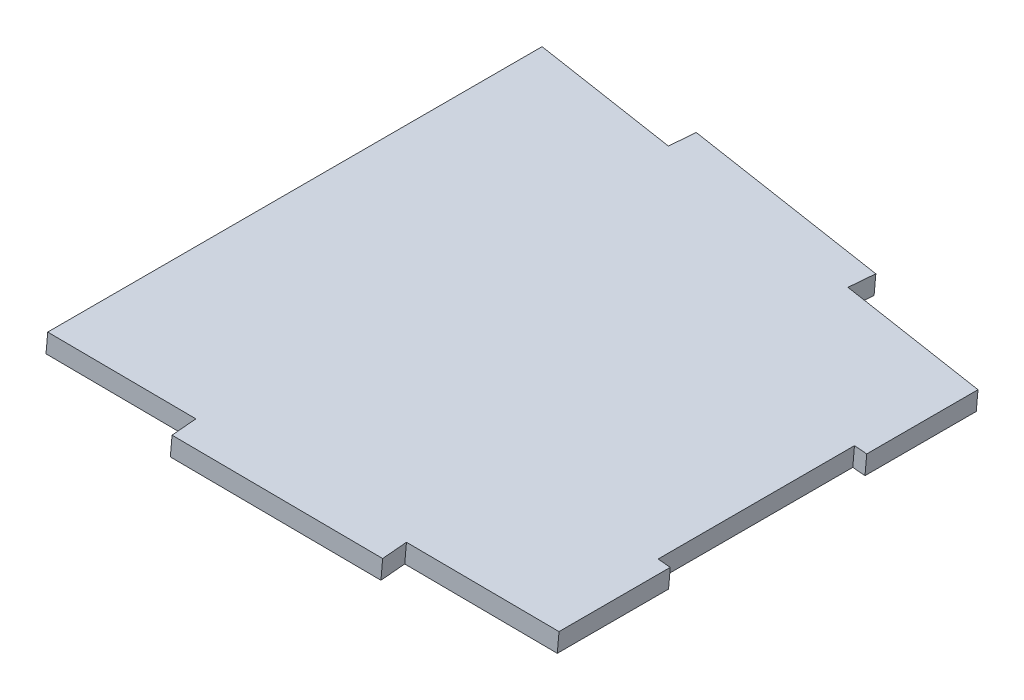
ISO-10303-21;
HEADER;
FILE_DESCRIPTION(('STEP AP214'),'2;1');
FILE_NAME('part.step','',(''),(''),'','','');
FILE_SCHEMA(('AUTOMOTIVE_DESIGN { 1 0 10303 214 1 1 1 1 }'));
ENDSEC;
DATA;
#1=APPLICATION_CONTEXT('core data for automotive mechanical design processes');
#2=APPLICATION_PROTOCOL_DEFINITION('international standard','automotive_design',2000,#1);
#3=PRODUCT_CONTEXT('',#1,'mechanical');
#4=PRODUCT('Part','Part','',(#3));
#5=PRODUCT_RELATED_PRODUCT_CATEGORY('part','',(#4));
#6=PRODUCT_DEFINITION_FORMATION('','',#4);
#7=PRODUCT_DEFINITION_CONTEXT('part definition',#1,'design');
#8=PRODUCT_DEFINITION('design','',#6,#7);
#9=PRODUCT_DEFINITION_SHAPE('','',#8);
#10=(LENGTH_UNIT() NAMED_UNIT(*) SI_UNIT(.MILLI.,.METRE.));
#11=(NAMED_UNIT(*) PLANE_ANGLE_UNIT() SI_UNIT($,.RADIAN.));
#12=(NAMED_UNIT(*) SI_UNIT($,.STERADIAN.) SOLID_ANGLE_UNIT());
#13=UNCERTAINTY_MEASURE_WITH_UNIT(LENGTH_MEASURE(1.E-05),#10,'distance_accuracy_value','');
#14=(GEOMETRIC_REPRESENTATION_CONTEXT(3) GLOBAL_UNCERTAINTY_ASSIGNED_CONTEXT((#13)) GLOBAL_UNIT_ASSIGNED_CONTEXT((#10,
#11,#12)) REPRESENTATION_CONTEXT('',''));
#15=CARTESIAN_POINT('',(0.,0.,0.));
#16=DIRECTION('',(0.,0.,1.));
#17=DIRECTION('',(1.,0.,0.));
#18=AXIS2_PLACEMENT_3D('',#15,#16,#17);
#19=CARTESIAN_POINT('',(258.079804920034,-8.8644840867057,0.));
#20=DIRECTION('',(-0.996194698091745,0.0871557427476583,0.));
#21=DIRECTION('',(-0.0871557427476583,-0.996194698091746,0.));
#22=AXIS2_PLACEMENT_3D('',#19,#20,#21);
#23=PLANE('',#22);
#24=DIRECTION('',(0.,0.,1.));
#25=VECTOR('',#24,1.);
#26=CARTESIAN_POINT('',(258.525876726991,-3.76586000240233,0.));
#27=LINE('',#26,#25);
#28=CARTESIAN_POINT('',(258.525876726991,-3.76586000240233,-63.9179118581299));
#29=VERTEX_POINT('',#28);
#30=CARTESIAN_POINT('',(258.525876726991,-3.76586000240233,63.9179118581299));
#31=VERTEX_POINT('',#30);
#32=EDGE_CURVE('E179',#29,#31,#27,.T.);
#33=ORIENTED_EDGE('',*,*,#32,.F.);
#34=DIRECTION('',(0.0871557427476583,0.996194698091745,0.));
#35=VECTOR('',#34,1.);
#36=CARTESIAN_POINT('',(258.079804920034,-8.8644840867057,-63.9179118581299));
#37=LINE('',#36,#35);
#38=CARTESIAN_POINT('',(258.079804920034,-8.8644840867057,-63.9179118581299));
#39=VERTEX_POINT('',#38);
#40=EDGE_CURVE('E11',#39,#29,#37,.T.);
#41=ORIENTED_EDGE('',*,*,#40,.F.);
#42=DIRECTION('',(0.,0.,1.));
#43=VECTOR('',#42,1.);
#44=CARTESIAN_POINT('',(258.079804920034,-8.8644840867057,0.));
#45=LINE('',#44,#43);
#46=CARTESIAN_POINT('',(258.079804920034,-8.8644840867057,63.9179118581299));
#47=VERTEX_POINT('',#46);
#48=EDGE_CURVE('E219',#39,#47,#45,.T.);
#49=ORIENTED_EDGE('',*,*,#48,.T.);
#50=DIRECTION('',(0.0871557427476583,0.996194698091745,0.));
#51=VECTOR('',#50,1.);
#52=CARTESIAN_POINT('',(258.079804920034,-8.8644840867057,63.9179118581299));
#53=LINE('',#52,#51);
#54=EDGE_CURVE('E38',#47,#31,#53,.T.);
#55=ORIENTED_EDGE('',*,*,#54,.T.);
#56=EDGE_LOOP('',(#33,#41,#49,#55));
#57=FACE_BOUND('',#56,.T.);
#58=ADVANCED_FACE('F35',(#57),#23,.T.);
#59=CARTESIAN_POINT('',(7.80807316709419,13.0314552426776,-83.8258905202956));
#60=DIRECTION('',(0.0786945263168506,-0.00688487893426692,-0.996875002179224));
#61=DIRECTION('',(-0.996898629733301,0.,-0.0786963915047348));
#62=AXIS2_PLACEMENT_3D('',#59,#60,#61);
#63=PLANE('',#62);
#64=DIRECTION('',(-0.99308159183114,0.0868833812415037,-0.0789951266229316));
#65=VECTOR('',#64,1.);
#66=CARTESIAN_POINT('',(8.25414497405098,18.130079326981,-83.8258905202956));
#67=LINE('',#66,#65);
#68=CARTESIAN_POINT('',(294.010971915314,-6.87040355551893,-61.095233831786));
#69=VERTEX_POINT('',#68);
#70=EDGE_CURVE('E217',#69,#29,#67,.T.);
#71=ORIENTED_EDGE('',*,*,#70,.F.);
#72=DIRECTION('',(0.0871557427476583,0.996194698091745,0.));
#73=VECTOR('',#72,1.);
#74=CARTESIAN_POINT('',(293.564900108357,-11.9690276398223,-61.095233831786));
#75=LINE('',#74,#73);
#76=CARTESIAN_POINT('',(293.564900108357,-11.9690276398223,-61.095233831786));
#77=VERTEX_POINT('',#76);
#78=EDGE_CURVE('E44',#77,#69,#75,.T.);
#79=ORIENTED_EDGE('',*,*,#78,.F.);
#80=DIRECTION('',(-0.99308159183114,0.0868833812415037,-0.0789951266229316));
#81=VECTOR('',#80,1.);
#82=CARTESIAN_POINT('',(7.80807316709419,13.0314552426776,-83.8258905202956));
#83=LINE('',#82,#81);
#84=EDGE_CURVE('E168',#77,#39,#83,.T.);
#85=ORIENTED_EDGE('',*,*,#84,.T.);
#86=ORIENTED_EDGE('',*,*,#40,.T.);
#87=EDGE_LOOP('',(#71,#79,#85,#86));
#88=FACE_BOUND('',#87,.T.);
#89=ADVANCED_FACE('F250',(#88),#63,.T.);
#90=CARTESIAN_POINT('',(286.947582256909,-11.3900873448729,22.7306566885092));
#91=DIRECTION('',(-0.99308159183114,0.0868833812415037,-0.0789951266229304));
#92=DIRECTION('',(-0.0871557427476583,-0.996194698091745,0.));
#93=AXIS2_PLACEMENT_3D('',#90,#91,#92);
#94=PLANE('',#93);
#95=DIRECTION('',(-0.0786945263168494,0.00688487893426681,0.996875002179224));
#96=VECTOR('',#95,1.);
#97=CARTESIAN_POINT('',(287.393654063866,-6.29146326056951,22.7306566885092));
#98=LINE('',#97,#96);
#99=CARTESIAN_POINT('',(294.538665930984,-6.91657079970055,-67.779878846399));
#100=VERTEX_POINT('',#99);
#101=EDGE_CURVE('E157',#100,#69,#98,.T.);
#102=ORIENTED_EDGE('',*,*,#101,.F.);
#103=DIRECTION('',(0.0871557427476583,0.996194698091745,0.));
#104=VECTOR('',#103,1.);
#105=CARTESIAN_POINT('',(294.092594124028,-12.0151948840039,-67.779878846399));
#106=LINE('',#105,#104);
#107=CARTESIAN_POINT('',(294.092594124028,-12.0151948840039,-67.779878846399));
#108=VERTEX_POINT('',#107);
#109=EDGE_CURVE('E152',#108,#100,#106,.T.);
#110=ORIENTED_EDGE('',*,*,#109,.F.);
#111=DIRECTION('',(-0.0786945263168494,0.00688487893426681,0.996875002179224));
#112=VECTOR('',#111,1.);
#113=CARTESIAN_POINT('',(286.947582256909,-11.3900873448729,22.7306566885092));
#114=LINE('',#113,#112);
#115=EDGE_CURVE('E155',#108,#77,#114,.T.);
#116=ORIENTED_EDGE('',*,*,#115,.T.);
#117=ORIENTED_EDGE('',*,*,#78,.T.);
#118=EDGE_LOOP('',(#102,#110,#116,#117));
#119=FACE_BOUND('',#118,.T.);
#120=ADVANCED_FACE('F154',(#119),#94,.T.);
#121=CARTESIAN_POINT('',(8.33576718276446,12.985287998496,-90.5105355349086));
#122=DIRECTION('',(0.0786945263168505,-0.00688487893426692,-0.996875002179224));
#123=DIRECTION('',(-0.996898629733301,0.,-0.0786963915047348));
#124=AXIS2_PLACEMENT_3D('',#121,#122,#123);
#125=PLANE('',#124);
#126=DIRECTION('',(-0.99308159183114,0.0868833812415037,-0.0789951266229316));
#127=VECTOR('',#126,1.);
#128=CARTESIAN_POINT('',(8.78183898972125,18.0839120827994,-90.5105355349086));
#129=LINE('',#128,#127);
#130=CARTESIAN_POINT('',(344.987210796006,-11.3302465667689,-63.7669264139541));
#131=VERTEX_POINT('',#130);
#132=EDGE_CURVE('E214',#131,#100,#129,.T.);
#133=ORIENTED_EDGE('',*,*,#132,.F.);
#134=DIRECTION('',(0.0871557427476583,0.996194698091745,0.));
#135=VECTOR('',#134,1.);
#136=CARTESIAN_POINT('',(344.54113898905,-16.4288706510723,-63.7669264139541));
#137=LINE('',#136,#135);
#138=CARTESIAN_POINT('',(344.54113898905,-16.4288706510723,-63.7669264139541));
#139=VERTEX_POINT('',#138);
#140=EDGE_CURVE('E162',#139,#131,#137,.T.);
#141=ORIENTED_EDGE('',*,*,#140,.F.);
#142=DIRECTION('',(-0.99308159183114,0.0868833812415037,-0.0789951266229316));
#143=VECTOR('',#142,1.);
#144=CARTESIAN_POINT('',(8.33576718276446,12.985287998496,-90.5105355349086));
#145=LINE('',#144,#143);
#146=EDGE_CURVE('E167',#139,#108,#145,.T.);
#147=ORIENTED_EDGE('',*,*,#146,.T.);
#148=ORIENTED_EDGE('',*,*,#109,.T.);
#149=EDGE_LOOP('',(#133,#141,#147,#148));
#150=FACE_BOUND('',#149,.T.);
#151=ADVANCED_FACE('F170',(#150),#125,.T.);
#152=CARTESIAN_POINT('',(337.39612712193,-15.8037631119412,26.7436091209568));
#153=DIRECTION('',(-0.993081591831139,0.0868833812415037,-0.0789951266229387));
#154=DIRECTION('',(-0.0871557427476583,-0.996194698091745,0.));
#155=AXIS2_PLACEMENT_3D('',#152,#153,#154);
#156=PLANE('',#155);
#157=DIRECTION('',(-0.0786945263168576,0.00688487893426753,0.996875002179223));
#158=VECTOR('',#157,1.);
#159=CARTESIAN_POINT('',(337.842198928887,-10.7051390276378,26.7436091209568));
#160=LINE('',#159,#158);
#161=CARTESIAN_POINT('',(344.459516780336,-11.2840793225873,-57.0822813993411));
#162=VERTEX_POINT('',#161);
#163=EDGE_CURVE('E211',#131,#162,#160,.T.);
#164=ORIENTED_EDGE('',*,*,#163,.T.);
#165=DIRECTION('',(0.0871557427476583,0.996194698091745,0.));
#166=VECTOR('',#165,1.);
#167=CARTESIAN_POINT('',(344.013444973379,-16.3827034068907,-57.0822813993411));
#168=LINE('',#167,#166);
#169=CARTESIAN_POINT('',(344.013444973379,-16.3827034068907,-57.0822813993411));
#170=VERTEX_POINT('',#169);
#171=EDGE_CURVE('E223',#170,#162,#168,.T.);
#172=ORIENTED_EDGE('',*,*,#171,.F.);
#173=DIRECTION('',(-0.0786945263168576,0.00688487893426753,0.996875002179223));
#174=VECTOR('',#173,1.);
#175=CARTESIAN_POINT('',(337.39612712193,-15.8037631119412,26.7436091209568));
#176=LINE('',#175,#174);
#177=EDGE_CURVE('E172',#139,#170,#176,.T.);
#178=ORIENTED_EDGE('',*,*,#177,.F.);
#179=ORIENTED_EDGE('',*,*,#140,.T.);
#180=EDGE_LOOP('',(#164,#172,#178,#179));
#181=FACE_BOUND('',#180,.T.);
#182=ADVANCED_FACE('F263',(#181),#156,.F.);
#183=CARTESIAN_POINT('',(7.80807316709419,13.0314552426776,-83.8258905202956));
#184=DIRECTION('',(0.0786945263168506,-0.00688487893426692,-0.996875002179224));
#185=DIRECTION('',(-0.996898629733301,0.,-0.0786963915047348));
#186=AXIS2_PLACEMENT_3D('',#183,#184,#185);
#187=PLANE('',#186);
#188=DIRECTION('',(-0.99308159183114,0.0868833812415037,-0.0789951266229316));
#189=VECTOR('',#188,1.);
#190=CARTESIAN_POINT('',(8.25414497405098,18.130079326981,-83.8258905202956));
#191=LINE('',#190,#189);
#192=CARTESIAN_POINT('',(381.,-14.4809573640672,-54.1756520523224));
#193=VERTEX_POINT('',#192);
#194=EDGE_CURVE('E208',#193,#162,#191,.T.);
#195=ORIENTED_EDGE('',*,*,#194,.F.);
#196=DIRECTION('',(0.0871557427476583,0.996194698091745,0.));
#197=VECTOR('',#196,1.);
#198=CARTESIAN_POINT('',(380.553928193043,-19.5795814483705,-54.1756520523224));
#199=LINE('',#198,#197);
#200=CARTESIAN_POINT('',(380.553928193043,-19.5795814483705,-54.1756520523224));
#201=VERTEX_POINT('',#200);
#202=EDGE_CURVE('E225',#201,#193,#199,.T.);
#203=ORIENTED_EDGE('',*,*,#202,.F.);
#204=DIRECTION('',(-0.99308159183114,0.0868833812415037,-0.0789951266229316));
#205=VECTOR('',#204,1.);
#206=CARTESIAN_POINT('',(7.80807316709419,13.0314552426776,-83.8258905202956));
#207=LINE('',#206,#205);
#208=EDGE_CURVE('E174',#201,#170,#207,.T.);
#209=ORIENTED_EDGE('',*,*,#208,.T.);
#210=ORIENTED_EDGE('',*,*,#171,.T.);
#211=EDGE_LOOP('',(#195,#203,#209,#210));
#212=FACE_BOUND('',#211,.T.);
#213=ADVANCED_FACE('F266',(#212),#187,.T.);
#214=CARTESIAN_POINT('',(380.553928193043,-19.5795814483705,0.));
#215=DIRECTION('',(0.996194698091745,-0.0871557427476583,0.));
#216=DIRECTION('',(0.0871557427476583,0.996194698091746,0.));
#217=AXIS2_PLACEMENT_3D('',#214,#215,#216);
#218=PLANE('',#217);
#219=DIRECTION('',(0.,0.,-1.));
#220=VECTOR('',#219,1.);
#221=CARTESIAN_POINT('',(381.,-14.4809573640672,0.));
#222=LINE('',#221,#220);
#223=CARTESIAN_POINT('',(381.,-14.4809573640672,-25.4));
#224=VERTEX_POINT('',#223);
#225=EDGE_CURVE('E201',#224,#193,#222,.T.);
#226=ORIENTED_EDGE('',*,*,#225,.F.);
#227=DIRECTION('',(0.0871557427476583,0.996194698091745,0.));
#228=VECTOR('',#227,1.);
#229=CARTESIAN_POINT('',(380.553928193043,-19.5795814483705,-25.4));
#230=LINE('',#229,#228);
#231=CARTESIAN_POINT('',(380.553928193043,-19.5795814483705,-25.4));
#232=VERTEX_POINT('',#231);
#233=EDGE_CURVE('E227',#232,#224,#230,.T.);
#234=ORIENTED_EDGE('',*,*,#233,.F.);
#235=DIRECTION('',(0.,0.,-1.));
#236=VECTOR('',#235,1.);
#237=CARTESIAN_POINT('',(380.553928193043,-19.5795814483705,0.));
#238=LINE('',#237,#236);
#239=EDGE_CURVE('E470',#232,#201,#238,.T.);
#240=ORIENTED_EDGE('',*,*,#239,.T.);
#241=ORIENTED_EDGE('',*,*,#202,.T.);
#242=EDGE_LOOP('',(#226,#234,#240,#241));
#243=FACE_BOUND('',#242,.T.);
#244=ADVANCED_FACE('F270',(#243),#218,.T.);
#245=CARTESIAN_POINT('',(1.19075531564619,13.610395537627,-25.4));
#246=DIRECTION('',(0.,0.,-1.));
#247=DIRECTION('',(-1.,0.,0.));
#248=AXIS2_PLACEMENT_3D('',#245,#246,#247);
#249=PLANE('',#248);
#250=DIRECTION('',(-0.996194698091746,0.0871557427476583,0.));
#251=VECTOR('',#250,1.);
#252=CARTESIAN_POINT('',(1.63682712260298,18.7090196219304,-25.4));
#253=LINE('',#252,#251);
#254=CARTESIAN_POINT('',(377.837081833558,-14.2042378808433,-25.4));
#255=VERTEX_POINT('',#254);
#256=EDGE_CURVE('E206',#224,#255,#253,.T.);
#257=ORIENTED_EDGE('',*,*,#256,.T.);
#258=DIRECTION('',(0.0871557427476583,0.996194698091745,0.));
#259=VECTOR('',#258,1.);
#260=CARTESIAN_POINT('',(377.391010026602,-19.3028619651467,-25.4));
#261=LINE('',#260,#259);
#262=CARTESIAN_POINT('',(377.391010026602,-19.3028619651467,-25.4));
#263=VERTEX_POINT('',#262);
#264=EDGE_CURVE('E229',#263,#255,#261,.T.);
#265=ORIENTED_EDGE('',*,*,#264,.F.);
#266=DIRECTION('',(-0.996194698091746,0.0871557427476583,0.));
#267=VECTOR('',#266,1.);
#268=CARTESIAN_POINT('',(1.19075531564619,13.610395537627,-25.4));
#269=LINE('',#268,#267);
#270=EDGE_CURVE('E478',#232,#263,#269,.T.);
#271=ORIENTED_EDGE('',*,*,#270,.F.);
#272=ORIENTED_EDGE('',*,*,#233,.T.);
#273=EDGE_LOOP('',(#257,#265,#271,#272));
#274=FACE_BOUND('',#273,.T.);
#275=ADVANCED_FACE('F274',(#274),#249,.F.);
#276=CARTESIAN_POINT('',(377.391010026602,-19.3028619651467,0.));
#277=DIRECTION('',(-0.996194698091745,0.0871557427476583,0.));
#278=DIRECTION('',(-0.0871557427476583,-0.996194698091746,0.));
#279=AXIS2_PLACEMENT_3D('',#276,#277,#278);
#280=PLANE('',#279);
#281=DIRECTION('',(0.,0.,1.));
#282=VECTOR('',#281,1.);
#283=CARTESIAN_POINT('',(377.837081833559,-14.2042378808434,0.));
#284=LINE('',#283,#282);
#285=CARTESIAN_POINT('',(377.837081833559,-14.2042378808434,25.4));
#286=VERTEX_POINT('',#285);
#287=EDGE_CURVE('E204',#255,#286,#284,.T.);
#288=ORIENTED_EDGE('',*,*,#287,.T.);
#289=DIRECTION('',(0.0871557427476583,0.996194698091745,0.));
#290=VECTOR('',#289,1.);
#291=CARTESIAN_POINT('',(377.391010026602,-19.3028619651467,25.4));
#292=LINE('',#291,#290);
#293=CARTESIAN_POINT('',(377.391010026602,-19.3028619651467,25.4));
#294=VERTEX_POINT('',#293);
#295=EDGE_CURVE('E232',#294,#286,#292,.T.);
#296=ORIENTED_EDGE('',*,*,#295,.F.);
#297=DIRECTION('',(0.,0.,1.));
#298=VECTOR('',#297,1.);
#299=CARTESIAN_POINT('',(377.391010026602,-19.3028619651467,0.));
#300=LINE('',#299,#298);
#301=EDGE_CURVE('E476',#263,#294,#300,.T.);
#302=ORIENTED_EDGE('',*,*,#301,.F.);
#303=ORIENTED_EDGE('',*,*,#264,.T.);
#304=EDGE_LOOP('',(#288,#296,#302,#303));
#305=FACE_BOUND('',#304,.T.);
#306=ADVANCED_FACE('F279',(#305),#280,.F.);
#307=CARTESIAN_POINT('',(1.19075531564619,13.610395537627,25.4));
#308=DIRECTION('',(0.,0.,1.));
#309=DIRECTION('',(1.,0.,0.));
#310=AXIS2_PLACEMENT_3D('',#307,#308,#309);
#311=PLANE('',#310);
#312=DIRECTION('',(0.996194698091746,-0.0871557427476583,0.));
#313=VECTOR('',#312,1.);
#314=CARTESIAN_POINT('',(1.63682712260298,18.7090196219304,25.4));
#315=LINE('',#314,#313);
#316=CARTESIAN_POINT('',(381.,-14.4809573640672,25.4));
#317=VERTEX_POINT('',#316);
#318=EDGE_CURVE('E200',#286,#317,#315,.T.);
#319=ORIENTED_EDGE('',*,*,#318,.T.);
#320=DIRECTION('',(0.0871557427476583,0.996194698091745,0.));
#321=VECTOR('',#320,1.);
#322=CARTESIAN_POINT('',(380.553928193043,-19.5795814483705,25.4));
#323=LINE('',#322,#321);
#324=CARTESIAN_POINT('',(380.553928193043,-19.5795814483705,25.4));
#325=VERTEX_POINT('',#324);
#326=EDGE_CURVE('E235',#325,#317,#323,.T.);
#327=ORIENTED_EDGE('',*,*,#326,.F.);
#328=DIRECTION('',(0.996194698091746,-0.0871557427476583,0.));
#329=VECTOR('',#328,1.);
#330=CARTESIAN_POINT('',(1.19075531564619,13.610395537627,25.4));
#331=LINE('',#330,#329);
#332=EDGE_CURVE('E468',#294,#325,#331,.T.);
#333=ORIENTED_EDGE('',*,*,#332,.F.);
#334=ORIENTED_EDGE('',*,*,#295,.T.);
#335=EDGE_LOOP('',(#319,#327,#333,#334));
#336=FACE_BOUND('',#335,.T.);
#337=ADVANCED_FACE('F283',(#336),#311,.F.);
#338=CARTESIAN_POINT('',(381.,-14.4809573640672,54.1756520523223));
#339=VERTEX_POINT('',#338);
#340=EDGE_CURVE('E197',#339,#317,#222,.T.);
#341=ORIENTED_EDGE('',*,*,#340,.F.);
#342=DIRECTION('',(0.0871557427476583,0.996194698091745,0.));
#343=VECTOR('',#342,1.);
#344=CARTESIAN_POINT('',(380.553928193043,-19.5795814483705,54.1756520523223));
#345=LINE('',#344,#343);
#346=CARTESIAN_POINT('',(380.553928193043,-19.5795814483705,54.1756520523223));
#347=VERTEX_POINT('',#346);
#348=EDGE_CURVE('E237',#347,#339,#345,.T.);
#349=ORIENTED_EDGE('',*,*,#348,.F.);
#350=EDGE_CURVE('E465',#347,#325,#238,.T.);
#351=ORIENTED_EDGE('',*,*,#350,.T.);
#352=ORIENTED_EDGE('',*,*,#326,.T.);
#353=EDGE_LOOP('',(#341,#349,#351,#352));
#354=FACE_BOUND('',#353,.T.);
#355=ADVANCED_FACE('F276',(#354),#218,.T.);
#356=CARTESIAN_POINT('',(7.80807316709422,13.0314552426776,83.8258905202957));
#357=DIRECTION('',(0.0786945263168509,-0.00688487893426696,0.996875002179224));
#358=DIRECTION('',(0.996898629733301,0.,-0.0786963915047352));
#359=AXIS2_PLACEMENT_3D('',#356,#357,#358);
#360=PLANE('',#359);
#361=DIRECTION('',(0.99308159183114,-0.0868833812415037,-0.078995126622932));
#362=VECTOR('',#361,1.);
#363=CARTESIAN_POINT('',(8.25414497405101,18.130079326981,83.8258905202957));
#364=LINE('',#363,#362);
#365=CARTESIAN_POINT('',(344.459516780336,-11.2840793225873,57.082281399341));
#366=VERTEX_POINT('',#365);
#367=EDGE_CURVE('E194',#366,#339,#364,.T.);
#368=ORIENTED_EDGE('',*,*,#367,.F.);
#369=DIRECTION('',(0.0871557427476583,0.996194698091745,0.));
#370=VECTOR('',#369,1.);
#371=CARTESIAN_POINT('',(344.013444973379,-16.3827034068907,57.082281399341));
#372=LINE('',#371,#370);
#373=CARTESIAN_POINT('',(344.013444973379,-16.3827034068907,57.082281399341));
#374=VERTEX_POINT('',#373);
#375=EDGE_CURVE('E239',#374,#366,#372,.T.);
#376=ORIENTED_EDGE('',*,*,#375,.F.);
#377=DIRECTION('',(0.99308159183114,-0.0868833812415037,-0.078995126622932));
#378=VECTOR('',#377,1.);
#379=CARTESIAN_POINT('',(7.80807316709422,13.0314552426776,83.8258905202957));
#380=LINE('',#379,#378);
#381=EDGE_CURVE('E462',#374,#347,#380,.T.);
#382=ORIENTED_EDGE('',*,*,#381,.T.);
#383=ORIENTED_EDGE('',*,*,#348,.T.);
#384=EDGE_LOOP('',(#368,#376,#382,#383));
#385=FACE_BOUND('',#384,.T.);
#386=ADVANCED_FACE('F288',(#385),#360,.T.);
#387=CARTESIAN_POINT('',(337.39612712193,-15.8037631119412,-26.7436091209569));
#388=DIRECTION('',(0.993081591831139,-0.0868833812415037,-0.0789951266229387));
#389=DIRECTION('',(0.0871557427476583,0.996194698091745,0.));
#390=AXIS2_PLACEMENT_3D('',#387,#388,#389);
#391=PLANE('',#390);
#392=DIRECTION('',(-0.0786945263168577,0.00688487893426755,-0.996875002179223));
#393=VECTOR('',#392,1.);
#394=CARTESIAN_POINT('',(337.842198928887,-10.7051390276378,-26.7436091209569));
#395=LINE('',#394,#393);
#396=CARTESIAN_POINT('',(344.987210796006,-11.3302465667689,63.7669264139541));
#397=VERTEX_POINT('',#396);
#398=EDGE_CURVE('E191',#397,#366,#395,.T.);
#399=ORIENTED_EDGE('',*,*,#398,.F.);
#400=DIRECTION('',(0.0871557427476583,0.996194698091745,0.));
#401=VECTOR('',#400,1.);
#402=CARTESIAN_POINT('',(344.54113898905,-16.4288706510723,63.7669264139541));
#403=LINE('',#402,#401);
#404=CARTESIAN_POINT('',(344.54113898905,-16.4288706510723,63.7669264139541));
#405=VERTEX_POINT('',#404);
#406=EDGE_CURVE('E241',#405,#397,#403,.T.);
#407=ORIENTED_EDGE('',*,*,#406,.F.);
#408=DIRECTION('',(-0.0786945263168577,0.00688487893426755,-0.996875002179223));
#409=VECTOR('',#408,1.);
#410=CARTESIAN_POINT('',(337.39612712193,-15.8037631119412,-26.7436091209569));
#411=LINE('',#410,#409);
#412=EDGE_CURVE('E466',#405,#374,#411,.T.);
#413=ORIENTED_EDGE('',*,*,#412,.T.);
#414=ORIENTED_EDGE('',*,*,#375,.T.);
#415=EDGE_LOOP('',(#399,#407,#413,#414));
#416=FACE_BOUND('',#415,.T.);
#417=ADVANCED_FACE('F291',(#416),#391,.T.);
#418=CARTESIAN_POINT('',(8.33576718276448,12.985287998496,90.5105355349086));
#419=DIRECTION('',(0.0786945263168508,-0.00688487893426694,0.996875002179224));
#420=DIRECTION('',(0.996898629733301,0.,-0.078696391504735));
#421=AXIS2_PLACEMENT_3D('',#418,#419,#420);
#422=PLANE('',#421);
#423=DIRECTION('',(0.99308159183114,-0.0868833812415037,-0.0789951266229318));
#424=VECTOR('',#423,1.);
#425=CARTESIAN_POINT('',(8.78183898972127,18.0839120827994,90.5105355349086));
#426=LINE('',#425,#424);
#427=CARTESIAN_POINT('',(294.538665930984,-6.91657079970054,67.779878846399));
#428=VERTEX_POINT('',#427);
#429=EDGE_CURVE('E188',#428,#397,#426,.T.);
#430=ORIENTED_EDGE('',*,*,#429,.F.);
#431=DIRECTION('',(0.0871557427476583,0.996194698091745,0.));
#432=VECTOR('',#431,1.);
#433=CARTESIAN_POINT('',(294.092594124028,-12.0151948840039,67.779878846399));
#434=LINE('',#433,#432);
#435=CARTESIAN_POINT('',(294.092594124028,-12.0151948840039,67.779878846399));
#436=VERTEX_POINT('',#435);
#437=EDGE_CURVE('E243',#436,#428,#434,.T.);
#438=ORIENTED_EDGE('',*,*,#437,.F.);
#439=DIRECTION('',(0.99308159183114,-0.0868833812415037,-0.0789951266229318));
#440=VECTOR('',#439,1.);
#441=CARTESIAN_POINT('',(8.33576718276448,12.985287998496,90.5105355349086));
#442=LINE('',#441,#440);
#443=EDGE_CURVE('E471',#436,#405,#442,.T.);
#444=ORIENTED_EDGE('',*,*,#443,.T.);
#445=ORIENTED_EDGE('',*,*,#406,.T.);
#446=EDGE_LOOP('',(#430,#438,#444,#445));
#447=FACE_BOUND('',#446,.T.);
#448=ADVANCED_FACE('F295',(#447),#422,.T.);
#449=CARTESIAN_POINT('',(286.947582256909,-11.3900873448729,-22.7306566885093));
#450=DIRECTION('',(0.99308159183114,-0.0868833812415037,-0.0789951266229306));
#451=DIRECTION('',(0.0871557427476583,0.996194698091745,0.));
#452=AXIS2_PLACEMENT_3D('',#449,#450,#451);
#453=PLANE('',#452);
#454=DIRECTION('',(-0.0786945263168496,0.00688487893426684,-0.996875002179224));
#455=VECTOR('',#454,1.);
#456=CARTESIAN_POINT('',(287.393654063866,-6.29146326056951,-22.7306566885093));
#457=LINE('',#456,#455);
#458=CARTESIAN_POINT('',(294.010971915314,-6.87040355551892,61.095233831786));
#459=VERTEX_POINT('',#458);
#460=EDGE_CURVE('E185',#428,#459,#457,.T.);
#461=ORIENTED_EDGE('',*,*,#460,.T.);
#462=DIRECTION('',(0.0871557427476583,0.996194698091745,0.));
#463=VECTOR('',#462,1.);
#464=CARTESIAN_POINT('',(293.564900108357,-11.9690276398223,61.095233831786));
#465=LINE('',#464,#463);
#466=CARTESIAN_POINT('',(293.564900108357,-11.9690276398223,61.095233831786));
#467=VERTEX_POINT('',#466);
#468=EDGE_CURVE('E244',#467,#459,#465,.T.);
#469=ORIENTED_EDGE('',*,*,#468,.F.);
#470=DIRECTION('',(-0.0786945263168496,0.00688487893426684,-0.996875002179224));
#471=VECTOR('',#470,1.);
#472=CARTESIAN_POINT('',(286.947582256909,-11.3900873448729,-22.7306566885093));
#473=LINE('',#472,#471);
#474=EDGE_CURVE('E497',#436,#467,#473,.T.);
#475=ORIENTED_EDGE('',*,*,#474,.F.);
#476=ORIENTED_EDGE('',*,*,#437,.T.);
#477=EDGE_LOOP('',(#461,#469,#475,#476));
#478=FACE_BOUND('',#477,.T.);
#479=ADVANCED_FACE('F299',(#478),#453,.F.);
#480=CARTESIAN_POINT('',(7.80807316709422,13.0314552426776,83.8258905202957));
#481=DIRECTION('',(0.0786945263168509,-0.00688487893426696,0.996875002179224));
#482=DIRECTION('',(0.996898629733301,0.,-0.0786963915047352));
#483=AXIS2_PLACEMENT_3D('',#480,#481,#482);
#484=PLANE('',#483);
#485=DIRECTION('',(0.99308159183114,-0.0868833812415037,-0.078995126622932));
#486=VECTOR('',#485,1.);
#487=CARTESIAN_POINT('',(8.25414497405101,18.130079326981,83.8258905202957));
#488=LINE('',#487,#486);
#489=EDGE_CURVE('E182',#31,#459,#488,.T.);
#490=ORIENTED_EDGE('',*,*,#489,.F.);
#491=ORIENTED_EDGE('',*,*,#54,.F.);
#492=DIRECTION('',(0.99308159183114,-0.0868833812415037,-0.078995126622932));
#493=VECTOR('',#492,1.);
#494=CARTESIAN_POINT('',(7.80807316709422,13.0314552426776,83.8258905202957));
#495=LINE('',#494,#493);
#496=EDGE_CURVE('E499',#47,#467,#495,.T.);
#497=ORIENTED_EDGE('',*,*,#496,.T.);
#498=ORIENTED_EDGE('',*,*,#468,.T.);
#499=EDGE_LOOP('',(#490,#491,#497,#498));
#500=FACE_BOUND('',#499,.T.);
#501=ADVANCED_FACE('F246',(#500),#484,.T.);
#502=CARTESIAN_POINT('',(1.19075531564619,13.610395537627,0.));
#503=DIRECTION('',(0.0871557427476583,0.996194698091746,0.));
#504=DIRECTION('',(-0.996194698091746,0.0871557427476583,0.));
#505=AXIS2_PLACEMENT_3D('',#502,#503,#504);
#506=PLANE('',#505);
#507=ORIENTED_EDGE('',*,*,#48,.F.);
#508=ORIENTED_EDGE('',*,*,#84,.F.);
#509=ORIENTED_EDGE('',*,*,#115,.F.);
#510=ORIENTED_EDGE('',*,*,#146,.F.);
#511=ORIENTED_EDGE('',*,*,#177,.T.);
#512=ORIENTED_EDGE('',*,*,#208,.F.);
#513=ORIENTED_EDGE('',*,*,#239,.F.);
#514=ORIENTED_EDGE('',*,*,#270,.T.);
#515=ORIENTED_EDGE('',*,*,#301,.T.);
#516=ORIENTED_EDGE('',*,*,#332,.T.);
#517=ORIENTED_EDGE('',*,*,#350,.F.);
#518=ORIENTED_EDGE('',*,*,#381,.F.);
#519=ORIENTED_EDGE('',*,*,#412,.F.);
#520=ORIENTED_EDGE('',*,*,#443,.F.);
#521=ORIENTED_EDGE('',*,*,#474,.T.);
#522=ORIENTED_EDGE('',*,*,#496,.F.);
#523=EDGE_LOOP('',(#507,#508,#509,#510,#511,#512,#513,#514,#515,#516,#517,#518,#519,#520,#521,#522));
#524=FACE_BOUND('',#523,.T.);
#525=ADVANCED_FACE('F166',(#524),#506,.F.);
#526=CARTESIAN_POINT('',(1.63682712260298,18.7090196219304,0.));
#527=DIRECTION('',(0.0871557427476583,0.996194698091746,0.));
#528=DIRECTION('',(-0.996194698091746,0.0871557427476583,0.));
#529=AXIS2_PLACEMENT_3D('',#526,#527,#528);
#530=PLANE('',#529);
#531=ORIENTED_EDGE('',*,*,#32,.T.);
#532=ORIENTED_EDGE('',*,*,#489,.T.);
#533=ORIENTED_EDGE('',*,*,#460,.F.);
#534=ORIENTED_EDGE('',*,*,#429,.T.);
#535=ORIENTED_EDGE('',*,*,#398,.T.);
#536=ORIENTED_EDGE('',*,*,#367,.T.);
#537=ORIENTED_EDGE('',*,*,#340,.T.);
#538=ORIENTED_EDGE('',*,*,#318,.F.);
#539=ORIENTED_EDGE('',*,*,#287,.F.);
#540=ORIENTED_EDGE('',*,*,#256,.F.);
#541=ORIENTED_EDGE('',*,*,#225,.T.);
#542=ORIENTED_EDGE('',*,*,#194,.T.);
#543=ORIENTED_EDGE('',*,*,#163,.F.);
#544=ORIENTED_EDGE('',*,*,#132,.T.);
#545=ORIENTED_EDGE('',*,*,#101,.T.);
#546=ORIENTED_EDGE('',*,*,#70,.T.);
#547=EDGE_LOOP('',(#531,#532,#533,#534,#535,#536,#537,#538,#539,#540,#541,#542,#543,#544,#545,#546));
#548=FACE_BOUND('',#547,.T.);
#549=ADVANCED_FACE('F249',(#548),#530,.T.);
#550=CLOSED_SHELL('',(#58,#89,#120,#151,#182,#213,#244,#275,#306,#337,#355,#386,#417,#448,#479,
#501,#525,#549));
#551=MANIFOLD_SOLID_BREP('B2',#550);
#552=ADVANCED_BREP_SHAPE_REPRESENTATION('',(#18,#551),#14);
#553=SHAPE_DEFINITION_REPRESENTATION(#9,#552);
ENDSEC;
END-ISO-10303-21;
